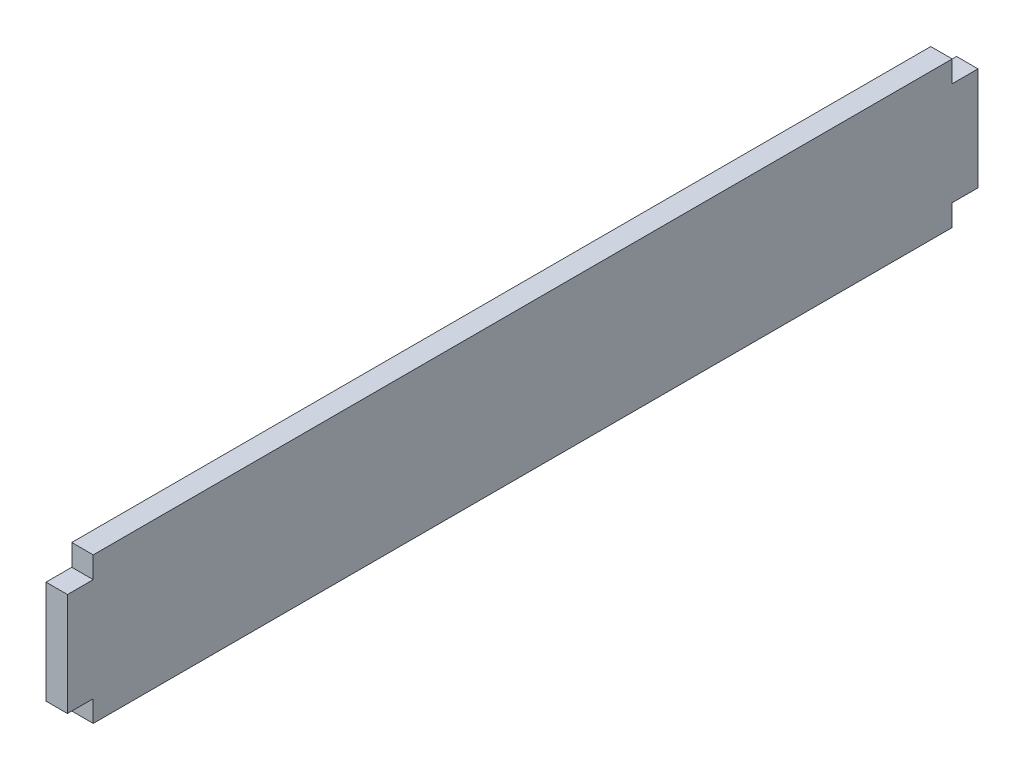
ISO-10303-21;
HEADER;
FILE_DESCRIPTION(('STEP AP214'),'2;1');
FILE_NAME('part.step','',(''),(''),'','','');
FILE_SCHEMA(('AUTOMOTIVE_DESIGN { 1 0 10303 214 1 1 1 1 }'));
ENDSEC;
DATA;
#1=APPLICATION_CONTEXT('core data for automotive mechanical design processes');
#2=APPLICATION_PROTOCOL_DEFINITION('international standard','automotive_design',2000,#1);
#3=PRODUCT_CONTEXT('',#1,'mechanical');
#4=PRODUCT('Part','Part','',(#3));
#5=PRODUCT_RELATED_PRODUCT_CATEGORY('part','',(#4));
#6=PRODUCT_DEFINITION_FORMATION('','',#4);
#7=PRODUCT_DEFINITION_CONTEXT('part definition',#1,'design');
#8=PRODUCT_DEFINITION('design','',#6,#7);
#9=PRODUCT_DEFINITION_SHAPE('','',#8);
#10=(LENGTH_UNIT() NAMED_UNIT(*) SI_UNIT(.MILLI.,.METRE.));
#11=(NAMED_UNIT(*) PLANE_ANGLE_UNIT() SI_UNIT($,.RADIAN.));
#12=(NAMED_UNIT(*) SI_UNIT($,.STERADIAN.) SOLID_ANGLE_UNIT());
#13=UNCERTAINTY_MEASURE_WITH_UNIT(LENGTH_MEASURE(1.E-05),#10,'distance_accuracy_value','');
#14=(GEOMETRIC_REPRESENTATION_CONTEXT(3) GLOBAL_UNCERTAINTY_ASSIGNED_CONTEXT((#13)) GLOBAL_UNIT_ASSIGNED_CONTEXT((#10,
#11,#12)) REPRESENTATION_CONTEXT('',''));
#15=CARTESIAN_POINT('',(0.,0.,0.));
#16=DIRECTION('',(0.,0.,1.));
#17=DIRECTION('',(1.,0.,0.));
#18=AXIS2_PLACEMENT_3D('',#15,#16,#17);
#19=CARTESIAN_POINT('',(0.,0.,100.));
#20=DIRECTION('',(0.,0.,1.));
#21=DIRECTION('',(1.,0.,0.));
#22=AXIS2_PLACEMENT_3D('',#19,#20,#21);
#23=PLANE('',#22);
#24=DIRECTION('',(0.,-1.,0.));
#25=VECTOR('',#24,1.);
#26=CARTESIAN_POINT('',(1.25,0.,100.));
#27=LINE('',#26,#25);
#28=CARTESIAN_POINT('',(1.25,-6.,100.));
#29=VERTEX_POINT('',#28);
#30=CARTESIAN_POINT('',(1.25,-8.5,100.));
#31=VERTEX_POINT('',#30);
#32=EDGE_CURVE('E195',#29,#31,#27,.T.);
#33=ORIENTED_EDGE('',*,*,#32,.F.);
#34=DIRECTION('',(-1.,0.,0.));
#35=VECTOR('',#34,1.);
#36=CARTESIAN_POINT('',(0.,-6.,100.));
#37=LINE('',#36,#35);
#38=CARTESIAN_POINT('',(-1.25,-6.,100.));
#39=VERTEX_POINT('',#38);
#40=EDGE_CURVE('E154',#29,#39,#37,.T.);
#41=ORIENTED_EDGE('',*,*,#40,.T.);
#42=DIRECTION('',(0.,-1.,0.));
#43=VECTOR('',#42,1.);
#44=CARTESIAN_POINT('',(-1.25,0.,100.));
#45=LINE('',#44,#43);
#46=CARTESIAN_POINT('',(-1.25,-8.5,100.));
#47=VERTEX_POINT('',#46);
#48=EDGE_CURVE('E133',#39,#47,#45,.T.);
#49=ORIENTED_EDGE('',*,*,#48,.T.);
#50=DIRECTION('',(1.,0.,0.));
#51=VECTOR('',#50,1.);
#52=CARTESIAN_POINT('',(0.,-8.5,100.));
#53=LINE('',#52,#51);
#54=EDGE_CURVE('E192',#47,#31,#53,.T.);
#55=ORIENTED_EDGE('',*,*,#54,.T.);
#56=EDGE_LOOP('',(#33,#41,#49,#55));
#57=FACE_BOUND('',#56,.T.);
#58=ADVANCED_FACE('F38',(#57),#23,.T.);
#59=CARTESIAN_POINT('',(-1.25,8.5,100.));
#60=VERTEX_POINT('',#59);
#61=CARTESIAN_POINT('',(-1.25,6.,100.));
#62=VERTEX_POINT('',#61);
#63=EDGE_CURVE('E189',#60,#62,#45,.T.);
#64=ORIENTED_EDGE('',*,*,#63,.T.);
#65=DIRECTION('',(1.,0.,0.));
#66=VECTOR('',#65,1.);
#67=CARTESIAN_POINT('',(0.,6.,100.));
#68=LINE('',#67,#66);
#69=CARTESIAN_POINT('',(1.25,6.,100.));
#70=VERTEX_POINT('',#69);
#71=EDGE_CURVE('E152',#62,#70,#68,.T.);
#72=ORIENTED_EDGE('',*,*,#71,.T.);
#73=CARTESIAN_POINT('',(1.25,8.5,100.));
#74=VERTEX_POINT('',#73);
#75=EDGE_CURVE('E196',#74,#70,#27,.T.);
#76=ORIENTED_EDGE('',*,*,#75,.F.);
#77=DIRECTION('',(1.,0.,0.));
#78=VECTOR('',#77,1.);
#79=CARTESIAN_POINT('',(0.,8.5,100.));
#80=LINE('',#79,#78);
#81=EDGE_CURVE('E199',#60,#74,#80,.T.);
#82=ORIENTED_EDGE('',*,*,#81,.F.);
#83=EDGE_LOOP('',(#64,#72,#76,#82));
#84=FACE_BOUND('',#83,.T.);
#85=ADVANCED_FACE('F250',(#84),#23,.T.);
#86=CARTESIAN_POINT('',(0.,0.,0.));
#87=DIRECTION('',(0.,0.,1.));
#88=DIRECTION('',(1.,0.,0.));
#89=AXIS2_PLACEMENT_3D('',#86,#87,#88);
#90=PLANE('',#89);
#91=DIRECTION('',(-1.,0.,0.));
#92=VECTOR('',#91,1.);
#93=CARTESIAN_POINT('',(0.,-6.,0.));
#94=LINE('',#93,#92);
#95=CARTESIAN_POINT('',(1.25,-6.,0.));
#96=VERTEX_POINT('',#95);
#97=CARTESIAN_POINT('',(-1.25,-6.,0.));
#98=VERTEX_POINT('',#97);
#99=EDGE_CURVE('E61',#96,#98,#94,.T.);
#100=ORIENTED_EDGE('',*,*,#99,.F.);
#101=DIRECTION('',(0.,-1.,0.));
#102=VECTOR('',#101,1.);
#103=CARTESIAN_POINT('',(1.25,0.,0.));
#104=LINE('',#103,#102);
#105=CARTESIAN_POINT('',(1.25,-8.5,0.));
#106=VERTEX_POINT('',#105);
#107=EDGE_CURVE('E208',#96,#106,#104,.T.);
#108=ORIENTED_EDGE('',*,*,#107,.T.);
#109=DIRECTION('',(1.,0.,0.));
#110=VECTOR('',#109,1.);
#111=CARTESIAN_POINT('',(0.,-8.5,0.));
#112=LINE('',#111,#110);
#113=CARTESIAN_POINT('',(-1.25,-8.5,0.));
#114=VERTEX_POINT('',#113);
#115=EDGE_CURVE('E205',#114,#106,#112,.T.);
#116=ORIENTED_EDGE('',*,*,#115,.F.);
#117=DIRECTION('',(0.,-1.,0.));
#118=VECTOR('',#117,1.);
#119=CARTESIAN_POINT('',(-1.25,0.,0.));
#120=LINE('',#119,#118);
#121=EDGE_CURVE('E180',#98,#114,#120,.T.);
#122=ORIENTED_EDGE('',*,*,#121,.F.);
#123=EDGE_LOOP('',(#100,#108,#116,#122));
#124=FACE_BOUND('',#123,.T.);
#125=ADVANCED_FACE('F227',(#124),#90,.F.);
#126=DIRECTION('',(1.,0.,0.));
#127=VECTOR('',#126,1.);
#128=CARTESIAN_POINT('',(0.,6.,0.));
#129=LINE('',#128,#127);
#130=CARTESIAN_POINT('',(-1.25,6.,0.));
#131=VERTEX_POINT('',#130);
#132=CARTESIAN_POINT('',(1.25,6.,0.));
#133=VERTEX_POINT('',#132);
#134=EDGE_CURVE('E167',#131,#133,#129,.T.);
#135=ORIENTED_EDGE('',*,*,#134,.F.);
#136=CARTESIAN_POINT('',(-1.25,8.5,0.));
#137=VERTEX_POINT('',#136);
#138=EDGE_CURVE('E203',#137,#131,#120,.T.);
#139=ORIENTED_EDGE('',*,*,#138,.F.);
#140=DIRECTION('',(1.,0.,0.));
#141=VECTOR('',#140,1.);
#142=CARTESIAN_POINT('',(0.,8.5,0.));
#143=LINE('',#142,#141);
#144=CARTESIAN_POINT('',(1.25,8.5,0.));
#145=VERTEX_POINT('',#144);
#146=EDGE_CURVE('E211',#137,#145,#143,.T.);
#147=ORIENTED_EDGE('',*,*,#146,.T.);
#148=EDGE_CURVE('E209',#145,#133,#104,.T.);
#149=ORIENTED_EDGE('',*,*,#148,.T.);
#150=EDGE_LOOP('',(#135,#139,#147,#149));
#151=FACE_BOUND('',#150,.T.);
#152=ADVANCED_FACE('F242',(#151),#90,.F.);
#153=CARTESIAN_POINT('',(-1.25,0.,100.));
#154=DIRECTION('',(1.,0.,0.));
#155=DIRECTION('',(0.,1.,0.));
#156=AXIS2_PLACEMENT_3D('',#153,#154,#155);
#157=PLANE('',#156);
#158=ORIENTED_EDGE('',*,*,#138,.T.);
#159=DIRECTION('',(0.,0.,1.));
#160=VECTOR('',#159,1.);
#161=CARTESIAN_POINT('',(-1.25,6.,-3.));
#162=LINE('',#161,#160);
#163=CARTESIAN_POINT('',(-1.25,6.,-3.));
#164=VERTEX_POINT('',#163);
#165=EDGE_CURVE('E181',#164,#131,#162,.T.);
#166=ORIENTED_EDGE('',*,*,#165,.F.);
#167=DIRECTION('',(0.,1.,0.));
#168=VECTOR('',#167,1.);
#169=CARTESIAN_POINT('',(-1.25,0.,-3.));
#170=LINE('',#169,#168);
#171=CARTESIAN_POINT('',(-1.25,-6.,-3.));
#172=VERTEX_POINT('',#171);
#173=EDGE_CURVE('E171',#172,#164,#170,.T.);
#174=ORIENTED_EDGE('',*,*,#173,.F.);
#175=DIRECTION('',(0.,0.,1.));
#176=VECTOR('',#175,1.);
#177=CARTESIAN_POINT('',(-1.25,-6.,-3.));
#178=LINE('',#177,#176);
#179=EDGE_CURVE('E177',#172,#98,#178,.T.);
#180=ORIENTED_EDGE('',*,*,#179,.T.);
#181=ORIENTED_EDGE('',*,*,#121,.T.);
#182=DIRECTION('',(0.,0.,-1.));
#183=VECTOR('',#182,1.);
#184=CARTESIAN_POINT('',(-1.25,-8.5,100.));
#185=LINE('',#184,#183);
#186=EDGE_CURVE('E11',#47,#114,#185,.T.);
#187=ORIENTED_EDGE('',*,*,#186,.F.);
#188=ORIENTED_EDGE('',*,*,#48,.F.);
#189=DIRECTION('',(0.,0.,-1.));
#190=VECTOR('',#189,1.);
#191=CARTESIAN_POINT('',(-1.25,-6.,103.));
#192=LINE('',#191,#190);
#193=CARTESIAN_POINT('',(-1.25,-6.,103.));
#194=VERTEX_POINT('',#193);
#195=EDGE_CURVE('E128',#194,#39,#192,.T.);
#196=ORIENTED_EDGE('',*,*,#195,.F.);
#197=DIRECTION('',(0.,1.,0.));
#198=VECTOR('',#197,1.);
#199=CARTESIAN_POINT('',(-1.25,0.,103.));
#200=LINE('',#199,#198);
#201=CARTESIAN_POINT('',(-1.25,6.,103.));
#202=VERTEX_POINT('',#201);
#203=EDGE_CURVE('E131',#194,#202,#200,.T.);
#204=ORIENTED_EDGE('',*,*,#203,.T.);
#205=DIRECTION('',(0.,0.,-1.));
#206=VECTOR('',#205,1.);
#207=CARTESIAN_POINT('',(-1.25,6.,103.));
#208=LINE('',#207,#206);
#209=EDGE_CURVE('E138',#202,#62,#208,.T.);
#210=ORIENTED_EDGE('',*,*,#209,.T.);
#211=ORIENTED_EDGE('',*,*,#63,.F.);
#212=DIRECTION('',(0.,0.,-1.));
#213=VECTOR('',#212,1.);
#214=CARTESIAN_POINT('',(-1.25,8.5,100.));
#215=LINE('',#214,#213);
#216=EDGE_CURVE('E202',#60,#137,#215,.T.);
#217=ORIENTED_EDGE('',*,*,#216,.T.);
#218=EDGE_LOOP('',(#158,#166,#174,#180,#181,#187,#188,#196,#204,#210,#211,#217));
#219=FACE_BOUND('',#218,.T.);
#220=ADVANCED_FACE('F40',(#219),#157,.F.);
#221=CARTESIAN_POINT('',(0.,-8.5,100.));
#222=DIRECTION('',(0.,1.,0.));
#223=DIRECTION('',(0.,0.,1.));
#224=AXIS2_PLACEMENT_3D('',#221,#222,#223);
#225=PLANE('',#224);
#226=ORIENTED_EDGE('',*,*,#115,.T.);
#227=DIRECTION('',(0.,0.,-1.));
#228=VECTOR('',#227,1.);
#229=CARTESIAN_POINT('',(1.25,-8.5,100.));
#230=LINE('',#229,#228);
#231=EDGE_CURVE('E46',#31,#106,#230,.T.);
#232=ORIENTED_EDGE('',*,*,#231,.F.);
#233=ORIENTED_EDGE('',*,*,#54,.F.);
#234=ORIENTED_EDGE('',*,*,#186,.T.);
#235=EDGE_LOOP('',(#226,#232,#233,#234));
#236=FACE_BOUND('',#235,.T.);
#237=ADVANCED_FACE('F226',(#236),#225,.F.);
#238=CARTESIAN_POINT('',(1.25,0.,100.));
#239=DIRECTION('',(1.,0.,0.));
#240=DIRECTION('',(0.,1.,0.));
#241=AXIS2_PLACEMENT_3D('',#238,#239,#240);
#242=PLANE('',#241);
#243=ORIENTED_EDGE('',*,*,#148,.F.);
#244=DIRECTION('',(0.,0.,-1.));
#245=VECTOR('',#244,1.);
#246=CARTESIAN_POINT('',(1.25,8.5,100.));
#247=LINE('',#246,#245);
#248=EDGE_CURVE('E215',#74,#145,#247,.T.);
#249=ORIENTED_EDGE('',*,*,#248,.F.);
#250=ORIENTED_EDGE('',*,*,#75,.T.);
#251=DIRECTION('',(0.,0.,-1.));
#252=VECTOR('',#251,1.);
#253=CARTESIAN_POINT('',(1.25,6.,103.));
#254=LINE('',#253,#252);
#255=CARTESIAN_POINT('',(1.25,6.,103.));
#256=VERTEX_POINT('',#255);
#257=EDGE_CURVE('E53',#256,#70,#254,.T.);
#258=ORIENTED_EDGE('',*,*,#257,.F.);
#259=DIRECTION('',(0.,-1.,0.));
#260=VECTOR('',#259,1.);
#261=CARTESIAN_POINT('',(1.25,0.,103.));
#262=LINE('',#261,#260);
#263=CARTESIAN_POINT('',(1.25,-6.,103.));
#264=VERTEX_POINT('',#263);
#265=EDGE_CURVE('E139',#256,#264,#262,.T.);
#266=ORIENTED_EDGE('',*,*,#265,.T.);
#267=DIRECTION('',(0.,0.,-1.));
#268=VECTOR('',#267,1.);
#269=CARTESIAN_POINT('',(1.25,-6.,103.));
#270=LINE('',#269,#268);
#271=EDGE_CURVE('E151',#264,#29,#270,.T.);
#272=ORIENTED_EDGE('',*,*,#271,.T.);
#273=ORIENTED_EDGE('',*,*,#32,.T.);
#274=ORIENTED_EDGE('',*,*,#231,.T.);
#275=ORIENTED_EDGE('',*,*,#107,.F.);
#276=DIRECTION('',(0.,0.,1.));
#277=VECTOR('',#276,1.);
#278=CARTESIAN_POINT('',(1.25,-6.,-3.));
#279=LINE('',#278,#277);
#280=CARTESIAN_POINT('',(1.25,-6.,-3.));
#281=VERTEX_POINT('',#280);
#282=EDGE_CURVE('E173',#281,#96,#279,.T.);
#283=ORIENTED_EDGE('',*,*,#282,.F.);
#284=DIRECTION('',(0.,-1.,0.));
#285=VECTOR('',#284,1.);
#286=CARTESIAN_POINT('',(1.25,0.,-3.));
#287=LINE('',#286,#285);
#288=CARTESIAN_POINT('',(1.25,6.,-3.));
#289=VERTEX_POINT('',#288);
#290=EDGE_CURVE('E166',#289,#281,#287,.T.);
#291=ORIENTED_EDGE('',*,*,#290,.F.);
#292=DIRECTION('',(0.,0.,1.));
#293=VECTOR('',#292,1.);
#294=CARTESIAN_POINT('',(1.25,6.,-3.));
#295=LINE('',#294,#293);
#296=EDGE_CURVE('E184',#289,#133,#295,.T.);
#297=ORIENTED_EDGE('',*,*,#296,.T.);
#298=EDGE_LOOP('',(#243,#249,#250,#258,#266,#272,#273,#274,#275,#283,#291,#297));
#299=FACE_BOUND('',#298,.T.);
#300=ADVANCED_FACE('F220',(#299),#242,.T.);
#301=CARTESIAN_POINT('',(0.,8.5,100.));
#302=DIRECTION('',(0.,1.,0.));
#303=DIRECTION('',(0.,0.,1.));
#304=AXIS2_PLACEMENT_3D('',#301,#302,#303);
#305=PLANE('',#304);
#306=ORIENTED_EDGE('',*,*,#146,.F.);
#307=ORIENTED_EDGE('',*,*,#216,.F.);
#308=ORIENTED_EDGE('',*,*,#81,.T.);
#309=ORIENTED_EDGE('',*,*,#248,.T.);
#310=EDGE_LOOP('',(#306,#307,#308,#309));
#311=FACE_BOUND('',#310,.T.);
#312=ADVANCED_FACE('F247',(#311),#305,.T.);
#313=CARTESIAN_POINT('',(0.,-6.,-3.));
#314=DIRECTION('',(0.,1.,0.));
#315=DIRECTION('',(0.,0.,1.));
#316=AXIS2_PLACEMENT_3D('',#313,#314,#315);
#317=PLANE('',#316);
#318=ORIENTED_EDGE('',*,*,#99,.T.);
#319=ORIENTED_EDGE('',*,*,#179,.F.);
#320=DIRECTION('',(-1.,0.,0.));
#321=VECTOR('',#320,1.);
#322=CARTESIAN_POINT('',(0.,-6.,-3.));
#323=LINE('',#322,#321);
#324=EDGE_CURVE('E163',#281,#172,#323,.T.);
#325=ORIENTED_EDGE('',*,*,#324,.F.);
#326=ORIENTED_EDGE('',*,*,#282,.T.);
#327=EDGE_LOOP('',(#318,#319,#325,#326));
#328=FACE_BOUND('',#327,.T.);
#329=ADVANCED_FACE('F232',(#328),#317,.F.);
#330=CARTESIAN_POINT('',(0.,6.,-3.));
#331=DIRECTION('',(0.,-1.,0.));
#332=DIRECTION('',(1.,0.,0.));
#333=AXIS2_PLACEMENT_3D('',#330,#331,#332);
#334=PLANE('',#333);
#335=ORIENTED_EDGE('',*,*,#134,.T.);
#336=ORIENTED_EDGE('',*,*,#296,.F.);
#337=DIRECTION('',(1.,0.,0.));
#338=VECTOR('',#337,1.);
#339=CARTESIAN_POINT('',(0.,6.,-3.));
#340=LINE('',#339,#338);
#341=EDGE_CURVE('E169',#164,#289,#340,.T.);
#342=ORIENTED_EDGE('',*,*,#341,.F.);
#343=ORIENTED_EDGE('',*,*,#165,.T.);
#344=EDGE_LOOP('',(#335,#336,#342,#343));
#345=FACE_BOUND('',#344,.T.);
#346=ADVANCED_FACE('F239',(#345),#334,.F.);
#347=CARTESIAN_POINT('',(0.,0.,-3.));
#348=DIRECTION('',(0.,0.,1.));
#349=DIRECTION('',(1.,0.,0.));
#350=AXIS2_PLACEMENT_3D('',#347,#348,#349);
#351=PLANE('',#350);
#352=ORIENTED_EDGE('',*,*,#324,.T.);
#353=ORIENTED_EDGE('',*,*,#173,.T.);
#354=ORIENTED_EDGE('',*,*,#341,.T.);
#355=ORIENTED_EDGE('',*,*,#290,.T.);
#356=EDGE_LOOP('',(#352,#353,#354,#355));
#357=FACE_BOUND('',#356,.T.);
#358=ADVANCED_FACE('F236',(#357),#351,.F.);
#359=CARTESIAN_POINT('',(0.,-6.,103.));
#360=DIRECTION('',(0.,-1.,0.));
#361=DIRECTION('',(0.,0.,-1.));
#362=AXIS2_PLACEMENT_3D('',#359,#360,#361);
#363=PLANE('',#362);
#364=ORIENTED_EDGE('',*,*,#40,.F.);
#365=ORIENTED_EDGE('',*,*,#271,.F.);
#366=DIRECTION('',(-1.,0.,0.));
#367=VECTOR('',#366,1.);
#368=CARTESIAN_POINT('',(0.,-6.,103.));
#369=LINE('',#368,#367);
#370=EDGE_CURVE('E146',#264,#194,#369,.T.);
#371=ORIENTED_EDGE('',*,*,#370,.T.);
#372=ORIENTED_EDGE('',*,*,#195,.T.);
#373=EDGE_LOOP('',(#364,#365,#371,#372));
#374=FACE_BOUND('',#373,.T.);
#375=ADVANCED_FACE('F150',(#374),#363,.T.);
#376=CARTESIAN_POINT('',(0.,6.,103.));
#377=DIRECTION('',(0.,1.,0.));
#378=DIRECTION('',(-1.,0.,0.));
#379=AXIS2_PLACEMENT_3D('',#376,#377,#378);
#380=PLANE('',#379);
#381=ORIENTED_EDGE('',*,*,#71,.F.);
#382=ORIENTED_EDGE('',*,*,#209,.F.);
#383=DIRECTION('',(1.,0.,0.));
#384=VECTOR('',#383,1.);
#385=CARTESIAN_POINT('',(0.,6.,103.));
#386=LINE('',#385,#384);
#387=EDGE_CURVE('E148',#202,#256,#386,.T.);
#388=ORIENTED_EDGE('',*,*,#387,.T.);
#389=ORIENTED_EDGE('',*,*,#257,.T.);
#390=EDGE_LOOP('',(#381,#382,#388,#389));
#391=FACE_BOUND('',#390,.T.);
#392=ADVANCED_FACE('F251',(#391),#380,.T.);
#393=CARTESIAN_POINT('',(0.,0.,103.));
#394=DIRECTION('',(0.,0.,-1.));
#395=DIRECTION('',(1.,0.,0.));
#396=AXIS2_PLACEMENT_3D('',#393,#394,#395);
#397=PLANE('',#396);
#398=ORIENTED_EDGE('',*,*,#370,.F.);
#399=ORIENTED_EDGE('',*,*,#265,.F.);
#400=ORIENTED_EDGE('',*,*,#387,.F.);
#401=ORIENTED_EDGE('',*,*,#203,.F.);
#402=EDGE_LOOP('',(#398,#399,#400,#401));
#403=FACE_BOUND('',#402,.T.);
#404=ADVANCED_FACE('F144',(#403),#397,.F.);
#405=CLOSED_SHELL('',(#58,#85,#125,#152,#220,#237,#300,#312,#329,#346,#358,#375,#392,#404));
#406=MANIFOLD_SOLID_BREP('B2',#405);
#407=ADVANCED_BREP_SHAPE_REPRESENTATION('',(#18,#406),#14);
#408=SHAPE_DEFINITION_REPRESENTATION(#9,#407);
ENDSEC;
END-ISO-10303-21;
